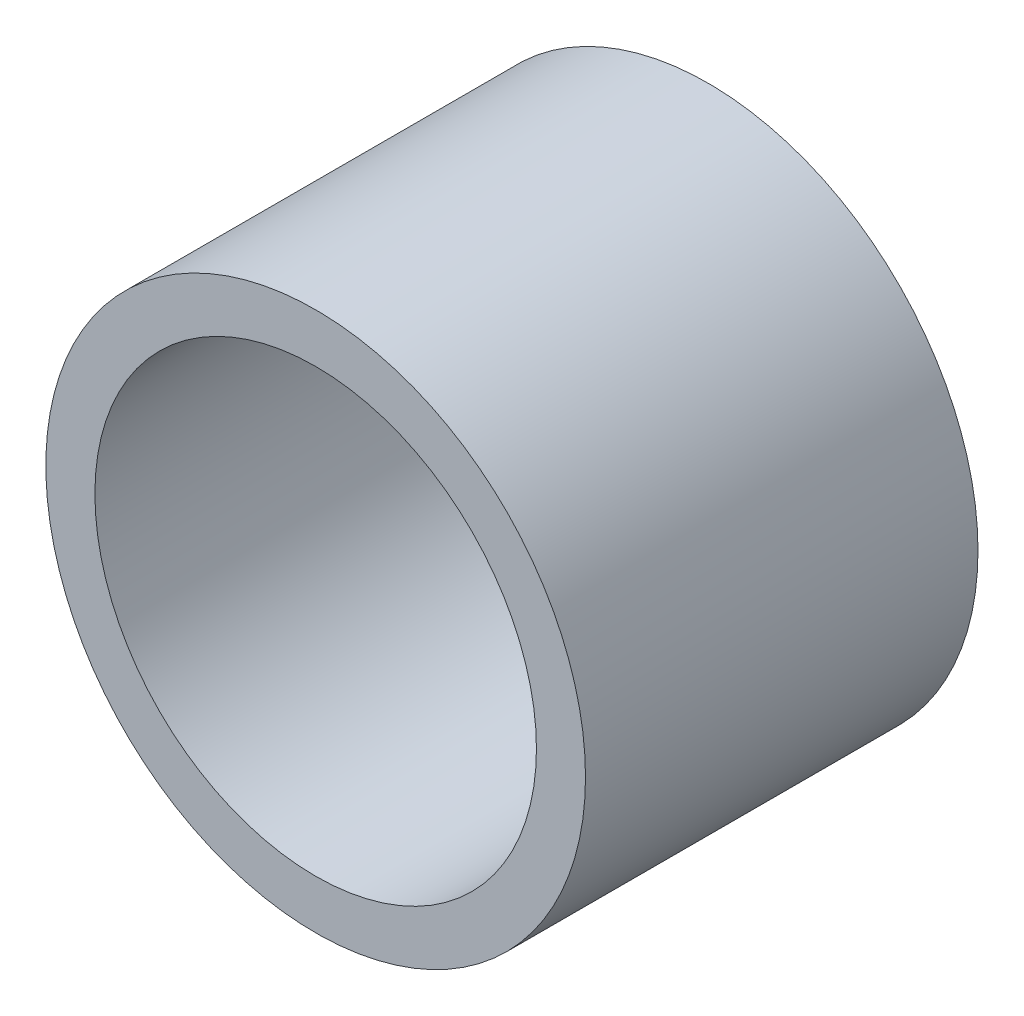
ISO-10303-21;
HEADER;
FILE_DESCRIPTION(('STEP AP214'),'2;1');
FILE_NAME('part.step','',(''),(''),'','','');
FILE_SCHEMA(('AUTOMOTIVE_DESIGN { 1 0 10303 214 1 1 1 1 }'));
ENDSEC;
DATA;
#1=APPLICATION_CONTEXT('core data for automotive mechanical design processes');
#2=APPLICATION_PROTOCOL_DEFINITION('international standard','automotive_design',2000,#1);
#3=PRODUCT_CONTEXT('',#1,'mechanical');
#4=PRODUCT('Part','Part','',(#3));
#5=PRODUCT_RELATED_PRODUCT_CATEGORY('part','',(#4));
#6=PRODUCT_DEFINITION_FORMATION('','',#4);
#7=PRODUCT_DEFINITION_CONTEXT('part definition',#1,'design');
#8=PRODUCT_DEFINITION('design','',#6,#7);
#9=PRODUCT_DEFINITION_SHAPE('','',#8);
#10=(LENGTH_UNIT() NAMED_UNIT(*) SI_UNIT(.MILLI.,.METRE.));
#11=(NAMED_UNIT(*) PLANE_ANGLE_UNIT() SI_UNIT($,.RADIAN.));
#12=(NAMED_UNIT(*) SI_UNIT($,.STERADIAN.) SOLID_ANGLE_UNIT());
#13=UNCERTAINTY_MEASURE_WITH_UNIT(LENGTH_MEASURE(1.E-05),#10,'distance_accuracy_value','');
#14=(GEOMETRIC_REPRESENTATION_CONTEXT(3) GLOBAL_UNCERTAINTY_ASSIGNED_CONTEXT((#13)) GLOBAL_UNIT_ASSIGNED_CONTEXT((#10,
#11,#12)) REPRESENTATION_CONTEXT('',''));
#15=CARTESIAN_POINT('',(0.,0.,0.));
#16=DIRECTION('',(0.,0.,1.));
#17=DIRECTION('',(1.,0.,0.));
#18=AXIS2_PLACEMENT_3D('',#15,#16,#17);
#19=CARTESIAN_POINT('',(0.,0.,8.));
#20=DIRECTION('',(0.,0.,1.));
#21=DIRECTION('',(1.,0.,0.));
#22=AXIS2_PLACEMENT_3D('',#19,#20,#21);
#23=PLANE('',#22);
#24=CARTESIAN_POINT('',(0.,0.,8.));
#25=DIRECTION('',(0.,0.,1.));
#26=DIRECTION('',(1.,0.,0.));
#27=AXIS2_PLACEMENT_3D('',#24,#25,#26);
#28=CIRCLE('',#27,5.5);
#29=CARTESIAN_POINT('',(5.5,0.,8.));
#30=VERTEX_POINT('',#29);
#31=EDGE_CURVE('E10',#30,#30,#28,.T.);
#32=ORIENTED_EDGE('',*,*,#31,.T.);
#33=EDGE_LOOP('',(#32));
#34=FACE_BOUND('',#33,.T.);
#35=CARTESIAN_POINT('',(0.,0.,8.));
#36=DIRECTION('',(0.,0.,1.));
#37=DIRECTION('',(1.,0.,0.));
#38=AXIS2_PLACEMENT_3D('',#35,#36,#37);
#39=CIRCLE('',#38,4.5);
#40=CARTESIAN_POINT('',(4.5,0.,8.));
#41=VERTEX_POINT('',#40);
#42=EDGE_CURVE('E44',#41,#41,#39,.T.);
#43=ORIENTED_EDGE('',*,*,#42,.F.);
#44=EDGE_LOOP('',(#43));
#45=FACE_BOUND('',#44,.T.);
#46=ADVANCED_FACE('F33',(#34,#45),#23,.T.);
#47=CARTESIAN_POINT('',(0.,0.,0.));
#48=DIRECTION('',(0.,0.,1.));
#49=DIRECTION('',(1.,0.,0.));
#50=AXIS2_PLACEMENT_3D('',#47,#48,#49);
#51=PLANE('',#50);
#52=CARTESIAN_POINT('',(0.,0.,0.));
#53=DIRECTION('',(0.,0.,1.));
#54=DIRECTION('',(1.,0.,0.));
#55=AXIS2_PLACEMENT_3D('',#52,#53,#54);
#56=CIRCLE('',#55,5.5);
#57=CARTESIAN_POINT('',(5.5,0.,0.));
#58=VERTEX_POINT('',#57);
#59=EDGE_CURVE('E37',#58,#58,#56,.T.);
#60=ORIENTED_EDGE('',*,*,#59,.F.);
#61=EDGE_LOOP('',(#60));
#62=FACE_BOUND('',#61,.T.);
#63=CARTESIAN_POINT('',(0.,0.,0.));
#64=DIRECTION('',(0.,0.,1.));
#65=DIRECTION('',(1.,0.,0.));
#66=AXIS2_PLACEMENT_3D('',#63,#64,#65);
#67=CIRCLE('',#66,4.5);
#68=CARTESIAN_POINT('',(4.5,0.,0.));
#69=VERTEX_POINT('',#68);
#70=EDGE_CURVE('E46',#69,#69,#67,.T.);
#71=ORIENTED_EDGE('',*,*,#70,.T.);
#72=EDGE_LOOP('',(#71));
#73=FACE_BOUND('',#72,.T.);
#74=ADVANCED_FACE('F56',(#62,#73),#51,.F.);
#75=CARTESIAN_POINT('',(0.,0.,8.));
#76=DIRECTION('',(0.,0.,-1.));
#77=DIRECTION('',(-1.,0.,0.));
#78=AXIS2_PLACEMENT_3D('',#75,#76,#77);
#79=CYLINDRICAL_SURFACE('',#78,5.5);
#80=ORIENTED_EDGE('',*,*,#31,.F.);
#81=EDGE_LOOP('',(#80));
#82=FACE_BOUND('',#81,.T.);
#83=ORIENTED_EDGE('',*,*,#59,.T.);
#84=EDGE_LOOP('',(#83));
#85=FACE_BOUND('',#84,.T.);
#86=ADVANCED_FACE('F35',(#82,#85),#79,.T.);
#87=CARTESIAN_POINT('',(0.,0.,8.));
#88=DIRECTION('',(0.,0.,-1.));
#89=DIRECTION('',(-1.,0.,0.));
#90=AXIS2_PLACEMENT_3D('',#87,#88,#89);
#91=CYLINDRICAL_SURFACE('',#90,4.5);
#92=ORIENTED_EDGE('',*,*,#42,.T.);
#93=EDGE_LOOP('',(#92));
#94=FACE_BOUND('',#93,.T.);
#95=ORIENTED_EDGE('',*,*,#70,.F.);
#96=EDGE_LOOP('',(#95));
#97=FACE_BOUND('',#96,.T.);
#98=ADVANCED_FACE('F52',(#94,#97),#91,.F.);
#99=CLOSED_SHELL('',(#46,#74,#86,#98));
#100=MANIFOLD_SOLID_BREP('B2',#99);
#101=ADVANCED_BREP_SHAPE_REPRESENTATION('',(#18,#100),#14);
#102=SHAPE_DEFINITION_REPRESENTATION(#9,#101);
ENDSEC;
END-ISO-10303-21;
